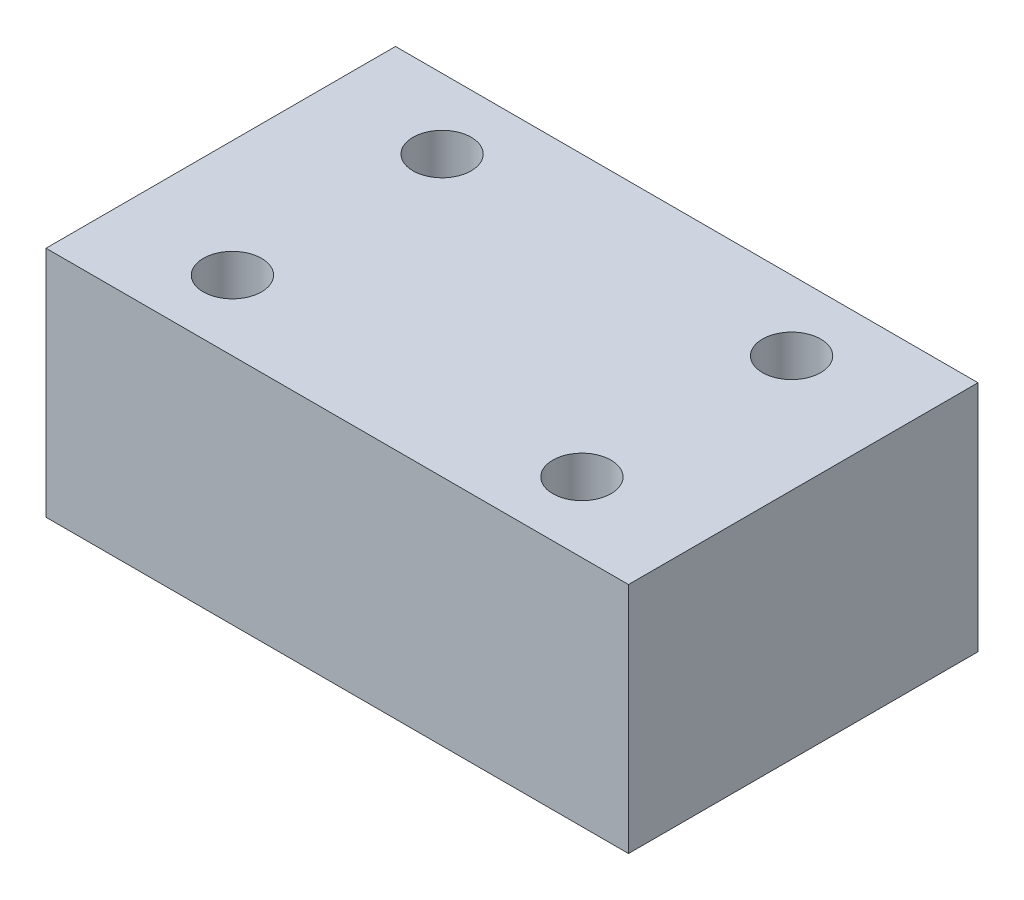
ISO-10303-21;
HEADER;
FILE_DESCRIPTION(('STEP AP214'),'2;1');
FILE_NAME('part.step','',(''),(''),'','','');
FILE_SCHEMA(('AUTOMOTIVE_DESIGN { 1 0 10303 214 1 1 1 1 }'));
ENDSEC;
DATA;
#1=APPLICATION_CONTEXT('core data for automotive mechanical design processes');
#2=APPLICATION_PROTOCOL_DEFINITION('international standard','automotive_design',2000,#1);
#3=PRODUCT_CONTEXT('',#1,'mechanical');
#4=PRODUCT('Part','Part','',(#3));
#5=PRODUCT_RELATED_PRODUCT_CATEGORY('part','',(#4));
#6=PRODUCT_DEFINITION_FORMATION('','',#4);
#7=PRODUCT_DEFINITION_CONTEXT('part definition',#1,'design');
#8=PRODUCT_DEFINITION('design','',#6,#7);
#9=PRODUCT_DEFINITION_SHAPE('','',#8);
#10=(LENGTH_UNIT() NAMED_UNIT(*) SI_UNIT(.MILLI.,.METRE.));
#11=(NAMED_UNIT(*) PLANE_ANGLE_UNIT() SI_UNIT($,.RADIAN.));
#12=(NAMED_UNIT(*) SI_UNIT($,.STERADIAN.) SOLID_ANGLE_UNIT());
#13=UNCERTAINTY_MEASURE_WITH_UNIT(LENGTH_MEASURE(1.E-05),#10,'distance_accuracy_value','');
#14=(GEOMETRIC_REPRESENTATION_CONTEXT(3) GLOBAL_UNCERTAINTY_ASSIGNED_CONTEXT((#13)) GLOBAL_UNIT_ASSIGNED_CONTEXT((#10,
#11,#12)) REPRESENTATION_CONTEXT('',''));
#15=CARTESIAN_POINT('',(0.,0.,0.));
#16=DIRECTION('',(0.,0.,1.));
#17=DIRECTION('',(1.,0.,0.));
#18=AXIS2_PLACEMENT_3D('',#15,#16,#17);
#19=CARTESIAN_POINT('',(125.,100.,75.));
#20=DIRECTION('',(-1.,0.,0.));
#21=DIRECTION('',(0.,0.,1.));
#22=AXIS2_PLACEMENT_3D('',#19,#20,#21);
#23=PLANE('',#22);
#24=DIRECTION('',(0.,0.,-1.));
#25=VECTOR('',#24,1.);
#26=CARTESIAN_POINT('',(125.,0.,75.));
#27=LINE('',#26,#25);
#28=CARTESIAN_POINT('',(125.,0.,75.));
#29=VERTEX_POINT('',#28);
#30=CARTESIAN_POINT('',(125.,0.,-75.));
#31=VERTEX_POINT('',#30);
#32=EDGE_CURVE('E102',#29,#31,#27,.T.);
#33=ORIENTED_EDGE('',*,*,#32,.T.);
#34=DIRECTION('',(0.,-1.,0.));
#35=VECTOR('',#34,1.);
#36=CARTESIAN_POINT('',(125.,100.,-75.));
#37=LINE('',#36,#35);
#38=CARTESIAN_POINT('',(125.,100.,-75.));
#39=VERTEX_POINT('',#38);
#40=EDGE_CURVE('E11',#39,#31,#37,.T.);
#41=ORIENTED_EDGE('',*,*,#40,.F.);
#42=DIRECTION('',(0.,0.,-1.));
#43=VECTOR('',#42,1.);
#44=CARTESIAN_POINT('',(125.,100.,75.));
#45=LINE('',#44,#43);
#46=CARTESIAN_POINT('',(125.,100.,75.));
#47=VERTEX_POINT('',#46);
#48=EDGE_CURVE('E90',#47,#39,#45,.T.);
#49=ORIENTED_EDGE('',*,*,#48,.F.);
#50=DIRECTION('',(0.,-1.,0.));
#51=VECTOR('',#50,1.);
#52=CARTESIAN_POINT('',(125.,100.,75.));
#53=LINE('',#52,#51);
#54=EDGE_CURVE('E98',#47,#29,#53,.T.);
#55=ORIENTED_EDGE('',*,*,#54,.T.);
#56=EDGE_LOOP('',(#33,#41,#49,#55));
#57=FACE_BOUND('',#56,.T.);
#58=ADVANCED_FACE('F39',(#57),#23,.F.);
#59=CARTESIAN_POINT('',(-125.,100.,-75.));
#60=DIRECTION('',(0.,0.,1.));
#61=DIRECTION('',(1.,0.,0.));
#62=AXIS2_PLACEMENT_3D('',#59,#60,#61);
#63=PLANE('',#62);
#64=DIRECTION('',(-1.,0.,0.));
#65=VECTOR('',#64,1.);
#66=CARTESIAN_POINT('',(-125.,0.,-75.));
#67=LINE('',#66,#65);
#68=CARTESIAN_POINT('',(-125.,0.,-75.));
#69=VERTEX_POINT('',#68);
#70=EDGE_CURVE('E94',#31,#69,#67,.T.);
#71=ORIENTED_EDGE('',*,*,#70,.T.);
#72=DIRECTION('',(0.,-1.,0.));
#73=VECTOR('',#72,1.);
#74=CARTESIAN_POINT('',(-125.,100.,-75.));
#75=LINE('',#74,#73);
#76=CARTESIAN_POINT('',(-125.,100.,-75.));
#77=VERTEX_POINT('',#76);
#78=EDGE_CURVE('E47',#77,#69,#75,.T.);
#79=ORIENTED_EDGE('',*,*,#78,.F.);
#80=DIRECTION('',(-1.,0.,0.));
#81=VECTOR('',#80,1.);
#82=CARTESIAN_POINT('',(-125.,100.,-75.));
#83=LINE('',#82,#81);
#84=EDGE_CURVE('E85',#39,#77,#83,.T.);
#85=ORIENTED_EDGE('',*,*,#84,.F.);
#86=ORIENTED_EDGE('',*,*,#40,.T.);
#87=EDGE_LOOP('',(#71,#79,#85,#86));
#88=FACE_BOUND('',#87,.T.);
#89=ADVANCED_FACE('F93',(#88),#63,.F.);
#90=CARTESIAN_POINT('',(-125.,100.,75.));
#91=DIRECTION('',(1.,0.,0.));
#92=DIRECTION('',(0.,0.,-1.));
#93=AXIS2_PLACEMENT_3D('',#90,#91,#92);
#94=PLANE('',#93);
#95=DIRECTION('',(0.,0.,1.));
#96=VECTOR('',#95,1.);
#97=CARTESIAN_POINT('',(-125.,0.,75.));
#98=LINE('',#97,#96);
#99=CARTESIAN_POINT('',(-125.,0.,75.));
#100=VERTEX_POINT('',#99);
#101=EDGE_CURVE('E72',#69,#100,#98,.T.);
#102=ORIENTED_EDGE('',*,*,#101,.T.);
#103=DIRECTION('',(0.,-1.,0.));
#104=VECTOR('',#103,1.);
#105=CARTESIAN_POINT('',(-125.,100.,75.));
#106=LINE('',#105,#104);
#107=CARTESIAN_POINT('',(-125.,100.,75.));
#108=VERTEX_POINT('',#107);
#109=EDGE_CURVE('E95',#108,#100,#106,.T.);
#110=ORIENTED_EDGE('',*,*,#109,.F.);
#111=DIRECTION('',(0.,0.,1.));
#112=VECTOR('',#111,1.);
#113=CARTESIAN_POINT('',(-125.,100.,75.));
#114=LINE('',#113,#112);
#115=EDGE_CURVE('E88',#77,#108,#114,.T.);
#116=ORIENTED_EDGE('',*,*,#115,.F.);
#117=ORIENTED_EDGE('',*,*,#78,.T.);
#118=EDGE_LOOP('',(#102,#110,#116,#117));
#119=FACE_BOUND('',#118,.T.);
#120=ADVANCED_FACE('F96',(#119),#94,.F.);
#121=CARTESIAN_POINT('',(-125.,100.,75.));
#122=DIRECTION('',(0.,0.,-1.));
#123=DIRECTION('',(-1.,0.,0.));
#124=AXIS2_PLACEMENT_3D('',#121,#122,#123);
#125=PLANE('',#124);
#126=DIRECTION('',(1.,0.,0.));
#127=VECTOR('',#126,1.);
#128=CARTESIAN_POINT('',(-125.,0.,75.));
#129=LINE('',#128,#127);
#130=EDGE_CURVE('E78',#100,#29,#129,.T.);
#131=ORIENTED_EDGE('',*,*,#130,.T.);
#132=ORIENTED_EDGE('',*,*,#54,.F.);
#133=DIRECTION('',(1.,0.,0.));
#134=VECTOR('',#133,1.);
#135=CARTESIAN_POINT('',(-125.,100.,75.));
#136=LINE('',#135,#134);
#137=EDGE_CURVE('E55',#108,#47,#136,.T.);
#138=ORIENTED_EDGE('',*,*,#137,.F.);
#139=ORIENTED_EDGE('',*,*,#109,.T.);
#140=EDGE_LOOP('',(#131,#132,#138,#139));
#141=FACE_BOUND('',#140,.T.);
#142=ADVANCED_FACE('F110',(#141),#125,.F.);
#143=CARTESIAN_POINT('',(0.,100.,0.));
#144=DIRECTION('',(0.,-1.,0.));
#145=DIRECTION('',(0.,0.,-1.));
#146=AXIS2_PLACEMENT_3D('',#143,#144,#145);
#147=PLANE('',#146);
#148=CARTESIAN_POINT('',(-75.,100.,45.));
#149=DIRECTION('',(0.,1.,0.));
#150=DIRECTION('',(0.,0.,1.));
#151=AXIS2_PLACEMENT_3D('',#148,#149,#150);
#152=CIRCLE('',#151,12.5);
#153=CARTESIAN_POINT('',(-75.,100.,57.5));
#154=VERTEX_POINT('',#153);
#155=EDGE_CURVE('E125',#154,#154,#152,.T.);
#156=ORIENTED_EDGE('',*,*,#155,.F.);
#157=EDGE_LOOP('',(#156));
#158=FACE_BOUND('',#157,.T.);
#159=CARTESIAN_POINT('',(75.,100.,45.));
#160=DIRECTION('',(0.,1.,0.));
#161=DIRECTION('',(0.,0.,1.));
#162=AXIS2_PLACEMENT_3D('',#159,#160,#161);
#163=CIRCLE('',#162,12.5);
#164=CARTESIAN_POINT('',(75.,100.,57.5));
#165=VERTEX_POINT('',#164);
#166=EDGE_CURVE('E131',#165,#165,#163,.T.);
#167=ORIENTED_EDGE('',*,*,#166,.F.);
#168=EDGE_LOOP('',(#167));
#169=FACE_BOUND('',#168,.T.);
#170=CARTESIAN_POINT('',(75.,100.,-45.));
#171=DIRECTION('',(0.,1.,0.));
#172=DIRECTION('',(0.,0.,1.));
#173=AXIS2_PLACEMENT_3D('',#170,#171,#172);
#174=CIRCLE('',#173,12.5);
#175=CARTESIAN_POINT('',(75.,100.,-32.5));
#176=VERTEX_POINT('',#175);
#177=EDGE_CURVE('E119',#176,#176,#174,.T.);
#178=ORIENTED_EDGE('',*,*,#177,.F.);
#179=EDGE_LOOP('',(#178));
#180=FACE_BOUND('',#179,.T.);
#181=CARTESIAN_POINT('',(-75.,100.,-45.));
#182=DIRECTION('',(0.,1.,0.));
#183=DIRECTION('',(0.,0.,1.));
#184=AXIS2_PLACEMENT_3D('',#181,#182,#183);
#185=CIRCLE('',#184,12.5);
#186=CARTESIAN_POINT('',(-75.,100.,-32.5));
#187=VERTEX_POINT('',#186);
#188=EDGE_CURVE('E116',#187,#187,#185,.T.);
#189=ORIENTED_EDGE('',*,*,#188,.F.);
#190=EDGE_LOOP('',(#189));
#191=FACE_BOUND('',#190,.T.);
#192=ORIENTED_EDGE('',*,*,#48,.T.);
#193=ORIENTED_EDGE('',*,*,#84,.T.);
#194=ORIENTED_EDGE('',*,*,#115,.T.);
#195=ORIENTED_EDGE('',*,*,#137,.T.);
#196=EDGE_LOOP('',(#192,#193,#194,#195));
#197=FACE_BOUND('',#196,.T.);
#198=ADVANCED_FACE('F86',(#158,#169,#180,#191,#197),#147,.F.);
#199=CARTESIAN_POINT('',(0.,0.,0.));
#200=DIRECTION('',(0.,-1.,0.));
#201=DIRECTION('',(0.,0.,-1.));
#202=AXIS2_PLACEMENT_3D('',#199,#200,#201);
#203=PLANE('',#202);
#204=ORIENTED_EDGE('',*,*,#32,.F.);
#205=ORIENTED_EDGE('',*,*,#130,.F.);
#206=ORIENTED_EDGE('',*,*,#101,.F.);
#207=ORIENTED_EDGE('',*,*,#70,.F.);
#208=EDGE_LOOP('',(#204,#205,#206,#207));
#209=FACE_BOUND('',#208,.T.);
#210=ADVANCED_FACE('F113',(#209),#203,.T.);
#211=CARTESIAN_POINT('',(-75.,80.,-45.));
#212=DIRECTION('',(0.,1.,0.));
#213=DIRECTION('',(0.,0.,1.));
#214=AXIS2_PLACEMENT_3D('',#211,#212,#213);
#215=CYLINDRICAL_SURFACE('',#214,12.5);
#216=CARTESIAN_POINT('',(-75.,80.,-45.));
#217=DIRECTION('',(0.,1.,0.));
#218=DIRECTION('',(0.,0.,1.));
#219=AXIS2_PLACEMENT_3D('',#216,#217,#218);
#220=CIRCLE('',#219,12.5);
#221=CARTESIAN_POINT('',(-75.,80.,-32.5));
#222=VERTEX_POINT('',#221);
#223=EDGE_CURVE('E105',#222,#222,#220,.T.);
#224=ORIENTED_EDGE('',*,*,#223,.F.);
#225=EDGE_LOOP('',(#224));
#226=FACE_BOUND('',#225,.T.);
#227=ORIENTED_EDGE('',*,*,#188,.T.);
#228=EDGE_LOOP('',(#227));
#229=FACE_BOUND('',#228,.T.);
#230=ADVANCED_FACE('F148',(#226,#229),#215,.F.);
#231=CARTESIAN_POINT('',(-75.,80.,-45.));
#232=DIRECTION('',(0.,1.,0.));
#233=DIRECTION('',(0.,0.,1.));
#234=AXIS2_PLACEMENT_3D('',#231,#232,#233);
#235=PLANE('',#234);
#236=ORIENTED_EDGE('',*,*,#223,.T.);
#237=EDGE_LOOP('',(#236));
#238=FACE_BOUND('',#237,.T.);
#239=ADVANCED_FACE('F150',(#238),#235,.T.);
#240=CARTESIAN_POINT('',(75.,80.,-45.));
#241=DIRECTION('',(0.,1.,0.));
#242=DIRECTION('',(0.,0.,1.));
#243=AXIS2_PLACEMENT_3D('',#240,#241,#242);
#244=CYLINDRICAL_SURFACE('',#243,12.5);
#245=CARTESIAN_POINT('',(75.,80.,-45.));
#246=DIRECTION('',(0.,1.,0.));
#247=DIRECTION('',(0.,0.,1.));
#248=AXIS2_PLACEMENT_3D('',#245,#246,#247);
#249=CIRCLE('',#248,12.5);
#250=CARTESIAN_POINT('',(75.,80.,-32.5));
#251=VERTEX_POINT('',#250);
#252=EDGE_CURVE('E134',#251,#251,#249,.T.);
#253=ORIENTED_EDGE('',*,*,#252,.F.);
#254=EDGE_LOOP('',(#253));
#255=FACE_BOUND('',#254,.T.);
#256=ORIENTED_EDGE('',*,*,#177,.T.);
#257=EDGE_LOOP('',(#256));
#258=FACE_BOUND('',#257,.T.);
#259=ADVANCED_FACE('F140',(#255,#258),#244,.F.);
#260=CARTESIAN_POINT('',(75.,80.,-45.));
#261=DIRECTION('',(0.,1.,0.));
#262=DIRECTION('',(0.,0.,1.));
#263=AXIS2_PLACEMENT_3D('',#260,#261,#262);
#264=PLANE('',#263);
#265=ORIENTED_EDGE('',*,*,#252,.T.);
#266=EDGE_LOOP('',(#265));
#267=FACE_BOUND('',#266,.T.);
#268=ADVANCED_FACE('F212',(#267),#264,.T.);
#269=CARTESIAN_POINT('',(75.,80.,45.));
#270=DIRECTION('',(0.,1.,0.));
#271=DIRECTION('',(0.,0.,1.));
#272=AXIS2_PLACEMENT_3D('',#269,#270,#271);
#273=CYLINDRICAL_SURFACE('',#272,12.5);
#274=CARTESIAN_POINT('',(75.,80.,45.));
#275=DIRECTION('',(0.,1.,0.));
#276=DIRECTION('',(0.,0.,1.));
#277=AXIS2_PLACEMENT_3D('',#274,#275,#276);
#278=CIRCLE('',#277,12.5);
#279=CARTESIAN_POINT('',(75.,80.,57.5));
#280=VERTEX_POINT('',#279);
#281=EDGE_CURVE('E128',#280,#280,#278,.T.);
#282=ORIENTED_EDGE('',*,*,#281,.F.);
#283=EDGE_LOOP('',(#282));
#284=FACE_BOUND('',#283,.T.);
#285=ORIENTED_EDGE('',*,*,#166,.T.);
#286=EDGE_LOOP('',(#285));
#287=FACE_BOUND('',#286,.T.);
#288=ADVANCED_FACE('F223',(#284,#287),#273,.F.);
#289=CARTESIAN_POINT('',(75.,80.,45.));
#290=DIRECTION('',(0.,1.,0.));
#291=DIRECTION('',(0.,0.,1.));
#292=AXIS2_PLACEMENT_3D('',#289,#290,#291);
#293=PLANE('',#292);
#294=ORIENTED_EDGE('',*,*,#281,.T.);
#295=EDGE_LOOP('',(#294));
#296=FACE_BOUND('',#295,.T.);
#297=ADVANCED_FACE('F234',(#296),#293,.T.);
#298=CARTESIAN_POINT('',(-75.,80.,45.));
#299=DIRECTION('',(0.,1.,0.));
#300=DIRECTION('',(0.,0.,1.));
#301=AXIS2_PLACEMENT_3D('',#298,#299,#300);
#302=CYLINDRICAL_SURFACE('',#301,12.5);
#303=CARTESIAN_POINT('',(-75.,80.,45.));
#304=DIRECTION('',(0.,1.,0.));
#305=DIRECTION('',(0.,0.,1.));
#306=AXIS2_PLACEMENT_3D('',#303,#304,#305);
#307=CIRCLE('',#306,12.5);
#308=CARTESIAN_POINT('',(-75.,80.,57.5));
#309=VERTEX_POINT('',#308);
#310=EDGE_CURVE('E122',#309,#309,#307,.T.);
#311=ORIENTED_EDGE('',*,*,#310,.F.);
#312=EDGE_LOOP('',(#311));
#313=FACE_BOUND('',#312,.T.);
#314=ORIENTED_EDGE('',*,*,#155,.T.);
#315=EDGE_LOOP('',(#314));
#316=FACE_BOUND('',#315,.T.);
#317=ADVANCED_FACE('F245',(#313,#316),#302,.F.);
#318=CARTESIAN_POINT('',(-75.,80.,45.));
#319=DIRECTION('',(0.,1.,0.));
#320=DIRECTION('',(0.,0.,1.));
#321=AXIS2_PLACEMENT_3D('',#318,#319,#320);
#322=PLANE('',#321);
#323=ORIENTED_EDGE('',*,*,#310,.T.);
#324=EDGE_LOOP('',(#323));
#325=FACE_BOUND('',#324,.T.);
#326=ADVANCED_FACE('F256',(#325),#322,.T.);
#327=CLOSED_SHELL('',(#58,#89,#120,#142,#198,#210,#230,#239,#259,#268,#288,#297,#317,#326));
#328=MANIFOLD_SOLID_BREP('B2',#327);
#329=ADVANCED_BREP_SHAPE_REPRESENTATION('',(#18,#328),#14);
#330=SHAPE_DEFINITION_REPRESENTATION(#9,#329);
ENDSEC;
END-ISO-10303-21;
